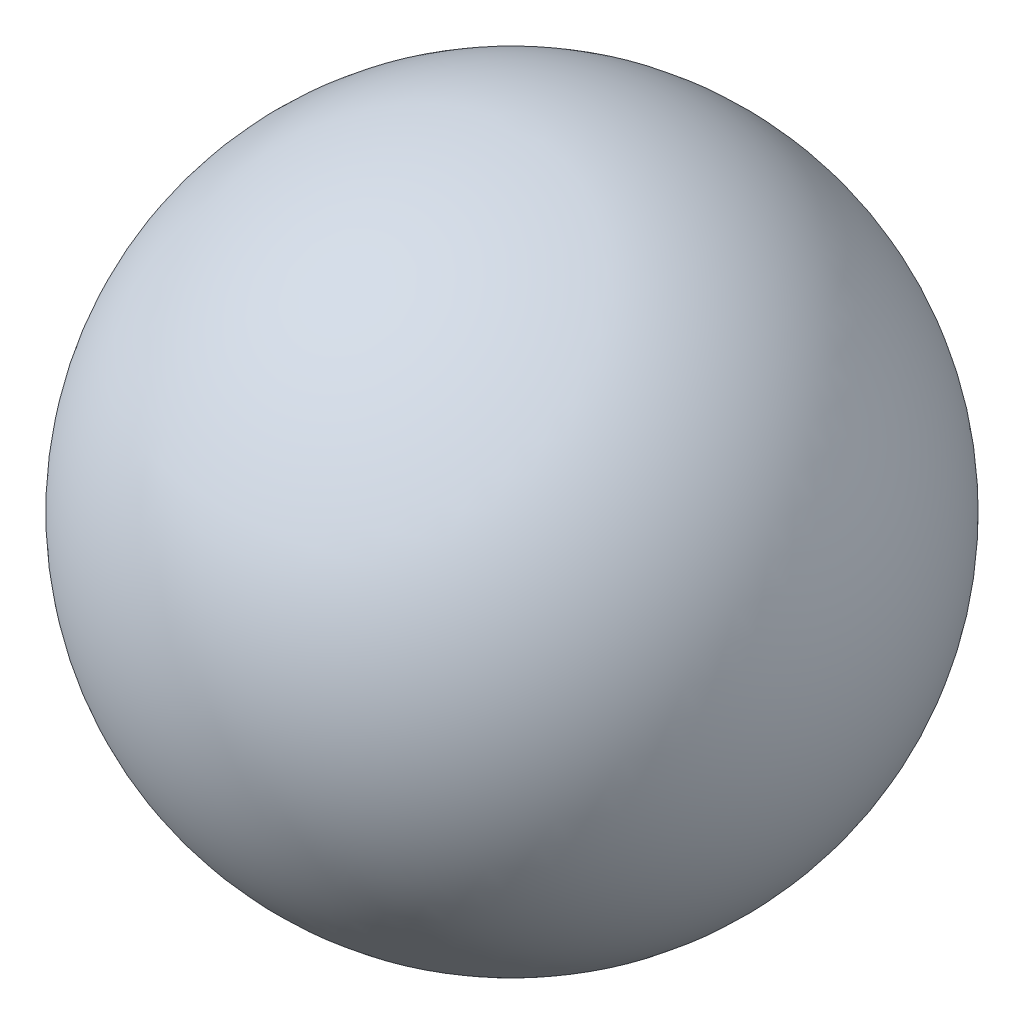
ISO-10303-21;
HEADER;
FILE_DESCRIPTION(('STEP AP214'),'2;1');
FILE_NAME('part.step','',(''),(''),'','','');
FILE_SCHEMA(('AUTOMOTIVE_DESIGN { 1 0 10303 214 1 1 1 1 }'));
ENDSEC;
DATA;
#1=APPLICATION_CONTEXT('core data for automotive mechanical design processes');
#2=APPLICATION_PROTOCOL_DEFINITION('international standard','automotive_design',2000,#1);
#3=PRODUCT_CONTEXT('',#1,'mechanical');
#4=PRODUCT('Part','Part','',(#3));
#5=PRODUCT_RELATED_PRODUCT_CATEGORY('part','',(#4));
#6=PRODUCT_DEFINITION_FORMATION('','',#4);
#7=PRODUCT_DEFINITION_CONTEXT('part definition',#1,'design');
#8=PRODUCT_DEFINITION('design','',#6,#7);
#9=PRODUCT_DEFINITION_SHAPE('','',#8);
#10=(LENGTH_UNIT() NAMED_UNIT(*) SI_UNIT(.MILLI.,.METRE.));
#11=(NAMED_UNIT(*) PLANE_ANGLE_UNIT() SI_UNIT($,.RADIAN.));
#12=(NAMED_UNIT(*) SI_UNIT($,.STERADIAN.) SOLID_ANGLE_UNIT());
#13=UNCERTAINTY_MEASURE_WITH_UNIT(LENGTH_MEASURE(1.E-05),#10,'distance_accuracy_value','');
#14=(GEOMETRIC_REPRESENTATION_CONTEXT(3) GLOBAL_UNCERTAINTY_ASSIGNED_CONTEXT((#13)) GLOBAL_UNIT_ASSIGNED_CONTEXT((#10,
#11,#12)) REPRESENTATION_CONTEXT('',''));
#15=CARTESIAN_POINT('',(0.,0.,0.));
#16=DIRECTION('',(0.,0.,1.));
#17=DIRECTION('',(1.,0.,0.));
#18=AXIS2_PLACEMENT_3D('',#15,#16,#17);
#19=CARTESIAN_POINT('',(0.,60.,0.));
#20=DIRECTION('',(0.,-1.,0.));
#21=DIRECTION('',(-1.,0.,0.));
#22=AXIS2_PLACEMENT_3D('',#19,#20,#21);
#23=SPHERICAL_SURFACE('',#22,60.);
#24=CARTESIAN_POINT('',(0.,0.,0.));
#25=VERTEX_POINT('',#24);
#26=VERTEX_LOOP('',#25);
#27=FACE_BOUND('',#26,.T.);
#28=ADVANCED_FACE('F33',(#27),#23,.T.);
#29=CLOSED_SHELL('',(#28));
#30=MANIFOLD_SOLID_BREP('B2',#29);
#31=ADVANCED_BREP_SHAPE_REPRESENTATION('',(#18,#30),#14);
#32=SHAPE_DEFINITION_REPRESENTATION(#9,#31);
ENDSEC;
END-ISO-10303-21;
